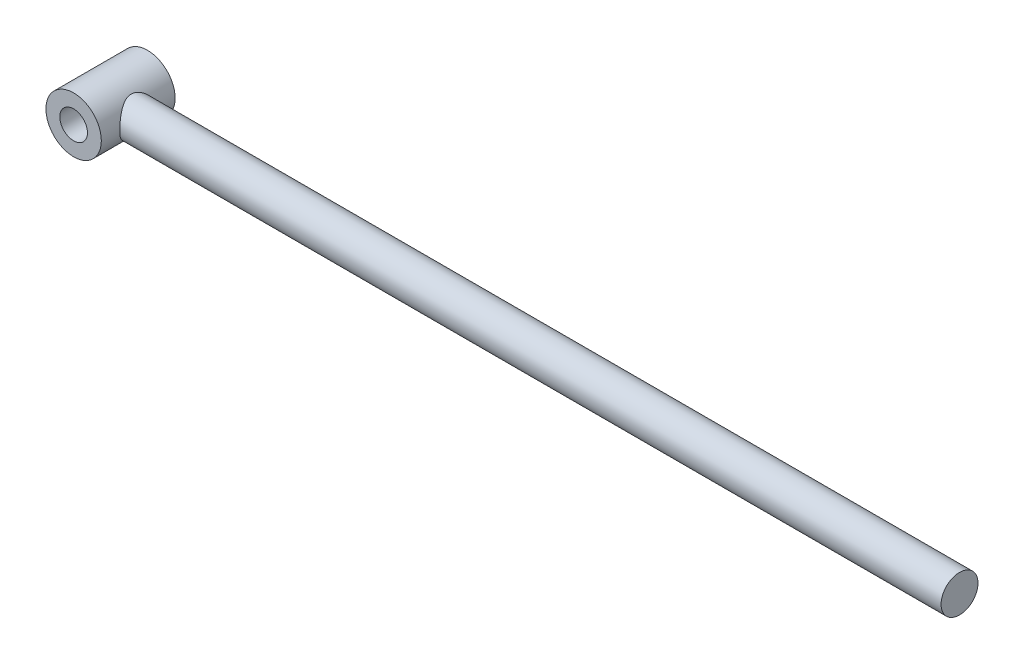
ISO-10303-21;
HEADER;
FILE_DESCRIPTION(('STEP AP214'),'2;1');
FILE_NAME('part.step','',(''),(''),'','','');
FILE_SCHEMA(('AUTOMOTIVE_DESIGN { 1 0 10303 214 1 1 1 1 }'));
ENDSEC;
DATA;
#1=APPLICATION_CONTEXT('core data for automotive mechanical design processes');
#2=APPLICATION_PROTOCOL_DEFINITION('international standard','automotive_design',2000,#1);
#3=PRODUCT_CONTEXT('',#1,'mechanical');
#4=PRODUCT('Part','Part','',(#3));
#5=PRODUCT_RELATED_PRODUCT_CATEGORY('part','',(#4));
#6=PRODUCT_DEFINITION_FORMATION('','',#4);
#7=PRODUCT_DEFINITION_CONTEXT('part definition',#1,'design');
#8=PRODUCT_DEFINITION('design','',#6,#7);
#9=PRODUCT_DEFINITION_SHAPE('','',#8);
#10=(LENGTH_UNIT() NAMED_UNIT(*) SI_UNIT(.MILLI.,.METRE.));
#11=(NAMED_UNIT(*) PLANE_ANGLE_UNIT() SI_UNIT($,.RADIAN.));
#12=(NAMED_UNIT(*) SI_UNIT($,.STERADIAN.) SOLID_ANGLE_UNIT());
#13=UNCERTAINTY_MEASURE_WITH_UNIT(LENGTH_MEASURE(1.E-05),#10,'distance_accuracy_value','');
#14=(GEOMETRIC_REPRESENTATION_CONTEXT(3) GLOBAL_UNCERTAINTY_ASSIGNED_CONTEXT((#13)) GLOBAL_UNIT_ASSIGNED_CONTEXT((#10,
#11,#12)) REPRESENTATION_CONTEXT('',''));
#15=CARTESIAN_POINT('',(0.,0.,0.));
#16=DIRECTION('',(0.,0.,1.));
#17=DIRECTION('',(1.,0.,0.));
#18=AXIS2_PLACEMENT_3D('',#15,#16,#17);
#19=CARTESIAN_POINT('',(0.,0.,40.));
#20=DIRECTION('',(0.,0.,-1.));
#21=DIRECTION('',(-1.,0.,0.));
#22=AXIS2_PLACEMENT_3D('',#19,#20,#21);
#23=CYLINDRICAL_SURFACE('',#22,30.);
#24=CARTESIAN_POINT('',(0.,0.,40.));
#25=DIRECTION('',(0.,0.,1.));
#26=DIRECTION('',(1.,0.,0.));
#27=AXIS2_PLACEMENT_3D('',#24,#25,#26);
#28=CIRCLE('',#27,30.);
#29=CARTESIAN_POINT('',(30.,0.,40.));
#30=VERTEX_POINT('',#29);
#31=EDGE_CURVE('E48',#30,#30,#28,.T.);
#32=ORIENTED_EDGE('',*,*,#31,.F.);
#33=EDGE_LOOP('',(#32));
#34=FACE_BOUND('',#33,.T.);
#35=CARTESIAN_POINT('',(0.,0.,-40.));
#36=DIRECTION('',(0.,0.,1.));
#37=DIRECTION('',(1.,0.,0.));
#38=AXIS2_PLACEMENT_3D('',#35,#36,#37);
#39=CIRCLE('',#38,30.);
#40=CARTESIAN_POINT('',(30.,0.,-40.));
#41=VERTEX_POINT('',#40);
#42=EDGE_CURVE('E52',#41,#41,#39,.T.);
#43=ORIENTED_EDGE('',*,*,#42,.T.);
#44=EDGE_LOOP('',(#43));
#45=FACE_BOUND('',#44,.T.);
#46=CARTESIAN_POINT('',(30.,0.,20.));
#47=CARTESIAN_POINT('',(29.9999998661981,-0.502432050357107,19.9999998708156));
#48=CARTESIAN_POINT('',(29.9873512767924,-1.00486659291617,19.981041890221));
#49=CARTESIAN_POINT('',(29.9370754507124,-2.00562861223446,19.9055087079442));
#50=CARTESIAN_POINT('',(29.8994480825663,-2.50395606736271,19.8489333082686));
#51=CARTESIAN_POINT('',(29.8001252135495,-3.49278874290095,19.6990002879968));
#52=CARTESIAN_POINT('',(29.7384203306489,-3.98329083644028,19.6056283291341));
#53=CARTESIAN_POINT('',(29.5924098661005,-4.9527367018995,19.3834395211629));
#54=CARTESIAN_POINT('',(29.5081040111715,-5.43168033398314,19.2546222434644));
#55=CARTESIAN_POINT('',(29.3192451350848,-6.3726831529905,18.9639204802124));
#56=CARTESIAN_POINT('',(29.2147907649452,-6.83481207132658,18.8021969068242));
#57=CARTESIAN_POINT('',(28.987567335659,-7.74207070686117,18.4471586375469));
#58=CARTESIAN_POINT('',(28.864798371266,-8.18720051199242,18.2538441050984));
#59=CARTESIAN_POINT('',(28.6033482003015,-9.05844037609498,17.8375381124749));
#60=CARTESIAN_POINT('',(28.4646675126729,-9.48455105472426,17.6145476201097));
#61=CARTESIAN_POINT('',(28.1739113247129,-10.3162415378409,17.1407197895657));
#62=CARTESIAN_POINT('',(28.0218342454824,-10.7218189133778,16.88987916806));
#63=CARTESIAN_POINT('',(27.6935578417576,-11.544666651525,16.3397046695659));
#64=CARTESIAN_POINT('',(27.5164065024113,-11.9600134544702,16.0380625153589));
#65=CARTESIAN_POINT('',(27.1528656210948,-12.7638755092378,15.4060039283267));
#66=CARTESIAN_POINT('',(26.9664756598522,-13.1523895414017,15.0755861890756));
#67=CARTESIAN_POINT('',(26.5877396332004,-13.9021114634373,14.3871695519229));
#68=CARTESIAN_POINT('',(26.3953859507486,-14.2632822184454,14.0291344326562));
#69=CARTESIAN_POINT('',(26.0086530551827,-14.9568597365416,13.2872215493219));
#70=CARTESIAN_POINT('',(25.8142737230126,-15.2892647981446,12.9033422589614));
#71=CARTESIAN_POINT('',(25.396836648899,-15.9745417178036,12.0482275933553));
#72=CARTESIAN_POINT('',(25.174096536266,-16.3223586443349,11.5727693191127));
#73=CARTESIAN_POINT('',(24.7376939344548,-16.9764877633748,10.5899657994356));
#74=CARTESIAN_POINT('',(24.5240335140448,-17.2827905315006,10.0826133516483));
#75=CARTESIAN_POINT('',(24.1134541975624,-17.8511644026812,9.03819236671138));
#76=CARTESIAN_POINT('',(23.9165127661255,-18.1132955295477,8.50116549380746));
#77=CARTESIAN_POINT('',(23.5472211433069,-18.5908454263022,7.39870988362545));
#78=CARTESIAN_POINT('',(23.3748591544978,-18.8062866319954,6.83329494920044));
#79=CARTESIAN_POINT('',(23.1083554699939,-19.13202887715,5.84404921175392));
#80=CARTESIAN_POINT('',(23.0059988256492,-19.254726201792,5.42648017350507));
#81=CARTESIAN_POINT('',(22.8211903176783,-19.4734126020971,4.58008091505703));
#82=CARTESIAN_POINT('',(22.7387352052499,-19.5694060373963,4.15125254556424));
#83=CARTESIAN_POINT('',(22.5966842761104,-19.7332623242764,3.28516192271634));
#84=CARTESIAN_POINT('',(22.5370547106277,-19.8011667190628,2.84791313270976));
#85=CARTESIAN_POINT('',(22.442775186748,-19.9079619855319,1.96717747103349));
#86=CARTESIAN_POINT('',(22.4081253652476,-19.9468526982109,1.5236905651906));
#87=CARTESIAN_POINT('',(22.3651578047493,-19.995018995311,0.631973802665962));
#88=CARTESIAN_POINT('',(22.3569497015249,-20.0041712760879,0.183731910267435));
#89=CARTESIAN_POINT('',(22.3675301691013,-19.9923398271623,-0.712030658740458));
#90=CARTESIAN_POINT('',(22.3863188316053,-19.971355995093,-1.15955133289481));
#91=CARTESIAN_POINT('',(22.4501086857203,-19.8996205096492,-2.050625095392));
#92=CARTESIAN_POINT('',(22.4951293541334,-19.8488467375743,-2.49417498677212));
#93=CARTESIAN_POINT('',(22.6095581655225,-19.7184018881212,-3.37377492739303));
#94=CARTESIAN_POINT('',(22.6789667736164,-19.6387302596127,-3.80982483343045));
#95=CARTESIAN_POINT('',(22.8360020403641,-19.4558684710411,-4.65260599507371));
#96=CARTESIAN_POINT('',(22.9226794986437,-19.3538839737256,-5.05977803330656));
#97=CARTESIAN_POINT('',(23.1133089528256,-19.1258219416928,-5.86323587316174));
#98=CARTESIAN_POINT('',(23.2172676308142,-18.9997350845369,-6.25951739443491));
#99=CARTESIAN_POINT('',(23.5509005263236,-18.5870898788947,-7.42993067111853));
#100=CARTESIAN_POINT('',(23.8024209013306,-18.2660472919538,-8.18608179416508));
#101=CARTESIAN_POINT('',(24.2342569329526,-17.6854431992285,-9.35228726673066));
#102=CARTESIAN_POINT('',(24.403077317783,-17.4522559964646,-9.78032481496439));
#103=CARTESIAN_POINT('',(24.7497432705651,-16.9570483876589,-10.6157476442302));
#104=CARTESIAN_POINT('',(24.9275896995493,-16.6950252280375,-11.023130947529));
#105=CARTESIAN_POINT('',(25.2885468949722,-16.1430567151301,-11.8167546644321));
#106=CARTESIAN_POINT('',(25.471663237886,-15.8530809594392,-12.2029713238621));
#107=CARTESIAN_POINT('',(25.8393965051977,-15.246358714758,-12.9530389311317));
#108=CARTESIAN_POINT('',(26.024013528533,-14.9296104475491,-13.3168883905748));
#109=CARTESIAN_POINT('',(26.4310497738324,-14.1989483888887,-14.097303197129));
#110=CARTESIAN_POINT('',(26.6530303956695,-13.7788159652825,-14.5083033678111));
#111=CARTESIAN_POINT('',(27.0885965336176,-12.9014676729698,-15.2937513429522));
#112=CARTESIAN_POINT('',(27.3021805000215,-12.4442450060576,-15.6681924187186));
#113=CARTESIAN_POINT('',(27.7153401348638,-11.4946861176089,-16.3775183221479));
#114=CARTESIAN_POINT('',(27.9149260225621,-11.0023760522687,-16.7124321311584));
#115=CARTESIAN_POINT('',(28.2949676279155,-9.98447354240779,-17.3397652164747));
#116=CARTESIAN_POINT('',(28.4754286055529,-9.45889031296221,-17.6321961852127));
#117=CARTESIAN_POINT('',(28.7791644068812,-8.4833461227497,-18.1181905483136));
#118=CARTESIAN_POINT('',(28.9067147978732,-8.03875717640116,-18.3198975753372));
#119=CARTESIAN_POINT('',(29.1437173052015,-7.13185034835575,-18.691623162803));
#120=CARTESIAN_POINT('',(29.2531715370476,-6.66953454679109,-18.8616454276103));
#121=CARTESIAN_POINT('',(29.4516277514227,-5.7299227277189,-19.1679937956703));
#122=CARTESIAN_POINT('',(29.5406434674396,-5.25263701566193,-19.3043425302522));
#123=CARTESIAN_POINT('',(29.6963305492252,-4.28575432400347,-19.5417523912564));
#124=CARTESIAN_POINT('',(29.7630015712691,-3.79615715514135,-19.6428129748477));
#125=CARTESIAN_POINT('',(29.872657894971,-2.80597314349125,-19.8085733139663));
#126=CARTESIAN_POINT('',(29.9155383206477,-2.30534759903096,-19.8731120951364));
#127=CARTESIAN_POINT('',(29.9760956021539,-1.29911991465958,-19.9641545523483));
#128=CARTESIAN_POINT('',(29.9937724250504,-0.793517768246534,-19.9906581786905));
#129=CARTESIAN_POINT('',(30.0034717951189,0.218464736427053,-20.0052080328604));
#130=CARTESIAN_POINT('',(29.9954953996663,0.724845061752678,-19.9932558457617));
#131=CARTESIAN_POINT('',(29.9540933231667,1.73418156784465,-19.931087455494));
#132=CARTESIAN_POINT('',(29.9206687283027,2.23713789383013,-19.8808728854445));
#133=CARTESIAN_POINT('',(29.8324414506934,3.20042176411033,-19.7478312691314));
#134=CARTESIAN_POINT('',(29.7793090042603,3.66125811656818,-19.6675483452082));
#135=CARTESIAN_POINT('',(29.6529106481444,4.57350157570509,-19.4756341111471));
#136=CARTESIAN_POINT('',(29.5796458717002,5.02490921158323,-19.3640045654864));
#137=CARTESIAN_POINT('',(29.4144446665676,5.91571607198156,-19.1106977521881));
#138=CARTESIAN_POINT('',(29.3225070223762,6.35511451265425,-18.9690185284518));
#139=CARTESIAN_POINT('',(29.1217004947068,7.21966385402625,-18.6571079304231));
#140=CARTESIAN_POINT('',(29.0128307093883,7.64481399436505,-18.486875035266));
#141=CARTESIAN_POINT('',(28.7730488442419,8.50426678457443,-18.1083152340667));
#142=CARTESIAN_POINT('',(28.641201691667,8.93756698372232,-17.8983067263232));
#143=CARTESIAN_POINT('',(28.3631030211141,9.78432512725706,-17.449829798643));
#144=CARTESIAN_POINT('',(28.2168510697156,10.1977824740429,-17.2113605223154));
#145=CARTESIAN_POINT('',(27.9124418593605,11.0036909497809,-16.7076242018634));
#146=CARTESIAN_POINT('',(27.7542793038351,11.3961325988641,-16.4423452174859));
#147=CARTESIAN_POINT('',(27.4287361682711,12.1587990167243,-15.8866695617355));
#148=CARTESIAN_POINT('',(27.2613545613898,12.5290213010131,-15.5962700903114));
#149=CARTESIAN_POINT('',(26.8930879740092,13.3031347178692,-14.9439528947196));
#150=CARTESIAN_POINT('',(26.6910905163229,13.7030923841241,-14.5779874749765));
#151=CARTESIAN_POINT('',(26.2826982946006,14.4709683638239,-13.8160664974289));
#152=CARTESIAN_POINT('',(26.0763029510259,14.8388824217615,-13.4201069693141));
#153=CARTESIAN_POINT('',(25.6635739697582,15.5417880165119,-12.5994023240134));
#154=CARTESIAN_POINT('',(25.4572404691787,15.876757023597,-12.174637839138));
#155=CARTESIAN_POINT('',(25.0497261492331,16.5122275702686,-11.2977646153286));
#156=CARTESIAN_POINT('',(24.8485448051984,16.81273263041,-10.8456586765927));
#157=CARTESIAN_POINT('',(24.4733023029991,17.3538627139578,-9.95448274755281));
#158=CARTESIAN_POINT('',(24.2983863656877,17.5974024349064,-9.51754297050518));
#159=CARTESIAN_POINT('',(23.9619407246742,18.0528546349536,-8.62244520074572));
#160=CARTESIAN_POINT('',(23.8004112149102,18.2647666558762,-8.16428690077693));
#161=CARTESIAN_POINT('',(23.4959190621918,18.6548371117046,-7.22866142786252));
#162=CARTESIAN_POINT('',(23.352929353255,18.8330449293941,-6.75122376801286));
#163=CARTESIAN_POINT('',(23.0904591353035,19.1539484457238,-5.77827480129949));
#164=CARTESIAN_POINT('',(22.9709732247938,19.2966523056608,-5.28276767814733));
#165=CARTESIAN_POINT('',(22.7795445121487,19.5220414226083,-4.36698264384053));
#166=CARTESIAN_POINT('',(22.7029160837044,19.6109049179647,-3.94920001271946));
#167=CARTESIAN_POINT('',(22.5714513943609,19.7620762933325,-3.1054686934564));
#168=CARTESIAN_POINT('',(22.5166125085731,19.82438737206,-2.6795209954077));
#169=CARTESIAN_POINT('',(22.4307802243878,19.9214537495162,-1.8224911908299));
#170=CARTESIAN_POINT('',(22.3997648547817,19.9562344390175,-1.39141418836717));
#171=CARTESIAN_POINT('',(22.3627151772862,19.9977438544737,-0.526818989046352));
#172=CARTESIAN_POINT('',(22.3566812339737,20.0044721710347,-0.093300756653625));
#173=CARTESIAN_POINT('',(22.3698449862022,19.9897505651309,0.773115287328889));
#174=CARTESIAN_POINT('',(22.3890570855061,19.9682845568072,1.20601260355544));
#175=CARTESIAN_POINT('',(22.4519644396444,19.89752521375,2.06770261584204));
#176=CARTESIAN_POINT('',(22.4956594937704,19.8482321071399,2.49649534552171));
#177=CARTESIAN_POINT('',(22.6059284972836,19.7225495457303,3.34758196945676));
#178=CARTESIAN_POINT('',(22.672528474229,19.6461292623078,3.76986789699179));
#179=CARTESIAN_POINT('',(22.8262602119977,19.4672984586528,4.60508117377623));
#180=CARTESIAN_POINT('',(22.9133946099072,19.3648846001243,5.01800731354381));
#181=CARTESIAN_POINT('',(23.1310818906606,19.1046848410163,5.94123169432083));
#182=CARTESIAN_POINT('',(23.2670175183132,18.9394160062732,6.44816076864198));
#183=CARTESIAN_POINT('',(23.5616278122302,18.5716220555323,7.44147650640459));
#184=CARTESIAN_POINT('',(23.7203087439171,18.3690866697139,7.92785746170607));
#185=CARTESIAN_POINT('',(24.0548494900776,17.928768029319,8.87885978411792));
#186=CARTESIAN_POINT('',(24.230727597647,17.6909470983741,9.34345718517344));
#187=CARTESIAN_POINT('',(24.5941802563021,17.1820850766219,10.2491849776676));
#188=CARTESIAN_POINT('',(24.781754189423,16.9110457402246,10.6903166066737));
#189=CARTESIAN_POINT('',(25.1672255632098,16.3319905343255,11.5560455039427));
#190=CARTESIAN_POINT('',(25.3652486390898,16.0233924051234,11.9801968484712));
#191=CARTESIAN_POINT('',(25.7637225763061,15.3745104302451,12.8022908705141));
#192=CARTESIAN_POINT('',(25.9641734317233,15.0342266618099,13.200233611914));
#193=CARTESIAN_POINT('',(26.3632502502894,14.3228973596636,13.9688530344093));
#194=CARTESIAN_POINT('',(26.5618756733661,13.951843028237,14.33952185996));
#195=CARTESIAN_POINT('',(26.9531887772778,13.180017889376,15.0520096270216));
#196=CARTESIAN_POINT('',(27.1458759630328,12.779244613665,15.3938261671826));
#197=CARTESIAN_POINT('',(27.5484327444244,11.8892953412499,16.0937728405199));
#198=CARTESIAN_POINT('',(27.7567878541469,11.3956949938791,16.4471788212645));
#199=CARTESIAN_POINT('',(28.1549839321458,10.372947033489,17.1106254017982));
#200=CARTESIAN_POINT('',(28.3448221999976,9.84379425458726,17.42065967928));
#201=CARTESIAN_POINT('',(28.7002669540513,8.7534583378163,17.9932104380746));
#202=CARTESIAN_POINT('',(28.8659031307225,8.19231563994947,18.2557852367735));
#203=CARTESIAN_POINT('',(29.1680076078479,7.04137086874954,18.7298173077689));
#204=CARTESIAN_POINT('',(29.3044861493112,6.45157894748342,18.9412925311521));
#205=CARTESIAN_POINT('',(29.5171038312658,5.38222751658728,19.2683981125324));
#206=CARTESIAN_POINT('',(29.5999120726272,4.90728446450014,19.3948839484347));
#207=CARTESIAN_POINT('',(29.7432935523992,3.94618639128292,19.6130133782002));
#208=CARTESIAN_POINT('',(29.8038703786017,3.46003319276103,19.7046625942176));
#209=CARTESIAN_POINT('',(29.9013488891663,2.48023551916962,19.8517933612465));
#210=CARTESIAN_POINT('',(29.9382651667603,1.98659585428405,19.9072972061548));
#211=CARTESIAN_POINT('',(29.9875912480541,0.995305041117371,19.9814012816267));
#212=CARTESIAN_POINT('',(30.0000001325294,0.497653743070644,20.0000001279558));
#213=CARTESIAN_POINT('',(30.,0.,20.));
#214=B_SPLINE_CURVE_WITH_KNOTS('',3,(#46,#47,#48,#49,#50,#51,#52,#53,#54,#55,#56,#57,#58,#59,
#60,#61,#62,#63,#64,#65,#66,#67,#68,#69,#70,#71,#72,#73,#74,#75,#76,#77,#78,#79,#80,#81,#82,#83,
#84,#85,#86,#87,#88,#89,#90,#91,#92,#93,#94,#95,#96,#97,#98,#99,#100,#101,#102,#103,#104,#105,
#106,#107,#108,#109,#110,#111,#112,#113,#114,#115,#116,#117,#118,#119,#120,#121,#122,#123,#124,
#125,#126,#127,#128,#129,#130,#131,#132,#133,#134,#135,#136,#137,#138,#139,#140,#141,#142,#143,
#144,#145,#146,#147,#148,#149,#150,#151,#152,#153,#154,#155,#156,#157,#158,#159,#160,#161,#162,
#163,#164,#165,#166,#167,#168,#169,#170,#171,#172,#173,#174,#175,#176,#177,#178,#179,#180,#181,
#182,#183,#184,#185,#186,#187,#188,#189,#190,#191,#192,#193,#194,#195,#196,#197,#198,#199,#200,
#201,#202,#203,#204,#205,#206,#207,#208,#209,#210,#211,#212,#213),.UNSPECIFIED.,.T.,.F.,(4,2,2,
2,2,2,2,2,2,2,2,2,2,2,2,2,2,2,2,2,2,2,2,2,2,2,2,2,2,2,2,2,2,2,2,2,2,2,2,2,2,2,2,2,2,2,2,2,2,2,2,
2,2,2,2,2,2,2,2,2,2,2,2,2,2,2,2,2,2,2,2,2,2,2,2,2,2,2,2,2,2,2,2,4),(0.,1.50678860030269,
3.01358513141216,4.52096938721657,6.02837187047945,7.52857302893605,9.02876642612416,
10.5289109101103,12.0292324383504,13.6567444840869,15.284330458243,16.9140886133164,
18.5439431024577,20.431131930561,22.3187484658921,24.2037789087041,26.0879015235946,
27.4279650999174,28.7678097709498,30.1056656880386,31.4435289369311,32.7869323000986,
34.1303402265693,35.4747468830929,36.8191791810432,38.1037263431644,39.3887713582513,
41.9574635192448,43.5039572638651,45.0505988133526,46.5989419535985,48.1473880150574,
50.0299431140749,51.9128440463346,53.7943557465543,55.6753486185392,57.1876211138398,
58.6997166935429,60.2107932404063,61.7218930308516,63.2396023156496,64.7573135836025,
66.2749622952646,67.7925462340977,69.2033177886316,70.6140099478306,72.0247939649324,
73.4356531490233,74.9318700392892,76.4281319624119,77.9250632379934,79.4221615843148,
81.1559974776003,82.8900632805819,84.6253068106235,86.3603729242013,87.9487273830719,
89.5371048494666,91.1231367124568,92.7088036566569,94.0093258243475,95.3096912764256,
96.6088560233589,97.9080397301251,99.2079649891922,100.507879591774,101.809276234171,
103.110840096639,104.759184673476,106.407984179069,108.058557042328,109.70904276911,
111.389510486189,113.069974106853,114.750919862111,116.432005383304,118.354868197109,
120.278011015838,122.198774401875,124.118862046836,125.61242765333,127.105752116314,
128.598154645697,130.090613151129),.UNSPECIFIED.);
#215=CARTESIAN_POINT('',(30.,0.,20.));
#216=VERTEX_POINT('',#215);
#217=EDGE_CURVE('E10',#216,#216,#214,.T.);
#218=ORIENTED_EDGE('',*,*,#217,.F.);
#219=EDGE_LOOP('',(#218));
#220=FACE_BOUND('',#219,.T.);
#221=ADVANCED_FACE('F37',(#34,#45,#220),#23,.T.);
#222=CARTESIAN_POINT('',(0.,0.,40.));
#223=DIRECTION('',(0.,0.,1.));
#224=DIRECTION('',(1.,0.,0.));
#225=AXIS2_PLACEMENT_3D('',#222,#223,#224);
#226=PLANE('',#225);
#227=ORIENTED_EDGE('',*,*,#31,.T.);
#228=EDGE_LOOP('',(#227));
#229=FACE_BOUND('',#228,.T.);
#230=CARTESIAN_POINT('',(0.,0.,40.));
#231=DIRECTION('',(0.,0.,1.));
#232=DIRECTION('',(1.,0.,0.));
#233=AXIS2_PLACEMENT_3D('',#230,#231,#232);
#234=CIRCLE('',#233,15.);
#235=CARTESIAN_POINT('',(15.,0.,40.));
#236=VERTEX_POINT('',#235);
#237=EDGE_CURVE('E57',#236,#236,#234,.T.);
#238=ORIENTED_EDGE('',*,*,#237,.F.);
#239=EDGE_LOOP('',(#238));
#240=FACE_BOUND('',#239,.T.);
#241=ADVANCED_FACE('F83',(#229,#240),#226,.T.);
#242=CARTESIAN_POINT('',(0.,0.,-40.));
#243=DIRECTION('',(0.,0.,1.));
#244=DIRECTION('',(1.,0.,0.));
#245=AXIS2_PLACEMENT_3D('',#242,#243,#244);
#246=PLANE('',#245);
#247=ORIENTED_EDGE('',*,*,#42,.F.);
#248=EDGE_LOOP('',(#247));
#249=FACE_BOUND('',#248,.T.);
#250=CARTESIAN_POINT('',(0.,0.,-40.));
#251=DIRECTION('',(0.,0.,1.));
#252=DIRECTION('',(1.,0.,0.));
#253=AXIS2_PLACEMENT_3D('',#250,#251,#252);
#254=CIRCLE('',#253,15.);
#255=CARTESIAN_POINT('',(15.,0.,-40.));
#256=VERTEX_POINT('',#255);
#257=EDGE_CURVE('E59',#256,#256,#254,.T.);
#258=ORIENTED_EDGE('',*,*,#257,.T.);
#259=EDGE_LOOP('',(#258));
#260=FACE_BOUND('',#259,.T.);
#261=ADVANCED_FACE('F79',(#249,#260),#246,.F.);
#262=CARTESIAN_POINT('',(0.,0.,40.));
#263=DIRECTION('',(0.,0.,-1.));
#264=DIRECTION('',(-1.,0.,0.));
#265=AXIS2_PLACEMENT_3D('',#262,#263,#264);
#266=CYLINDRICAL_SURFACE('',#265,15.);
#267=ORIENTED_EDGE('',*,*,#237,.T.);
#268=EDGE_LOOP('',(#267));
#269=FACE_BOUND('',#268,.T.);
#270=ORIENTED_EDGE('',*,*,#257,.F.);
#271=EDGE_LOOP('',(#270));
#272=FACE_BOUND('',#271,.T.);
#273=ADVANCED_FACE('F72',(#269,#272),#266,.F.);
#274=CARTESIAN_POINT('',(920.,0.,0.));
#275=DIRECTION('',(-1.,0.,0.));
#276=DIRECTION('',(0.,0.,1.));
#277=AXIS2_PLACEMENT_3D('',#274,#275,#276);
#278=CYLINDRICAL_SURFACE('',#277,20.);
#279=CARTESIAN_POINT('',(920.,0.,0.));
#280=DIRECTION('',(1.,0.,0.));
#281=DIRECTION('',(0.,0.,-1.));
#282=AXIS2_PLACEMENT_3D('',#279,#280,#281);
#283=CIRCLE('',#282,20.);
#284=CARTESIAN_POINT('',(920.,0.,-20.));
#285=VERTEX_POINT('',#284);
#286=EDGE_CURVE('E62',#285,#285,#283,.T.);
#287=ORIENTED_EDGE('',*,*,#286,.F.);
#288=EDGE_LOOP('',(#287));
#289=FACE_BOUND('',#288,.T.);
#290=ORIENTED_EDGE('',*,*,#217,.T.);
#291=EDGE_LOOP('',(#290));
#292=FACE_BOUND('',#291,.T.);
#293=ADVANCED_FACE('F70',(#289,#292),#278,.T.);
#294=CARTESIAN_POINT('',(920.,0.,0.));
#295=DIRECTION('',(1.,0.,0.));
#296=DIRECTION('',(0.,0.,-1.));
#297=AXIS2_PLACEMENT_3D('',#294,#295,#296);
#298=PLANE('',#297);
#299=ORIENTED_EDGE('',*,*,#286,.T.);
#300=EDGE_LOOP('',(#299));
#301=FACE_BOUND('',#300,.T.);
#302=ADVANCED_FACE('F68',(#301),#298,.T.);
#303=CLOSED_SHELL('',(#221,#241,#261,#273,#293,#302));
#304=MANIFOLD_SOLID_BREP('B2',#303);
#305=ADVANCED_BREP_SHAPE_REPRESENTATION('',(#18,#304),#14);
#306=SHAPE_DEFINITION_REPRESENTATION(#9,#305);
ENDSEC;
END-ISO-10303-21;
